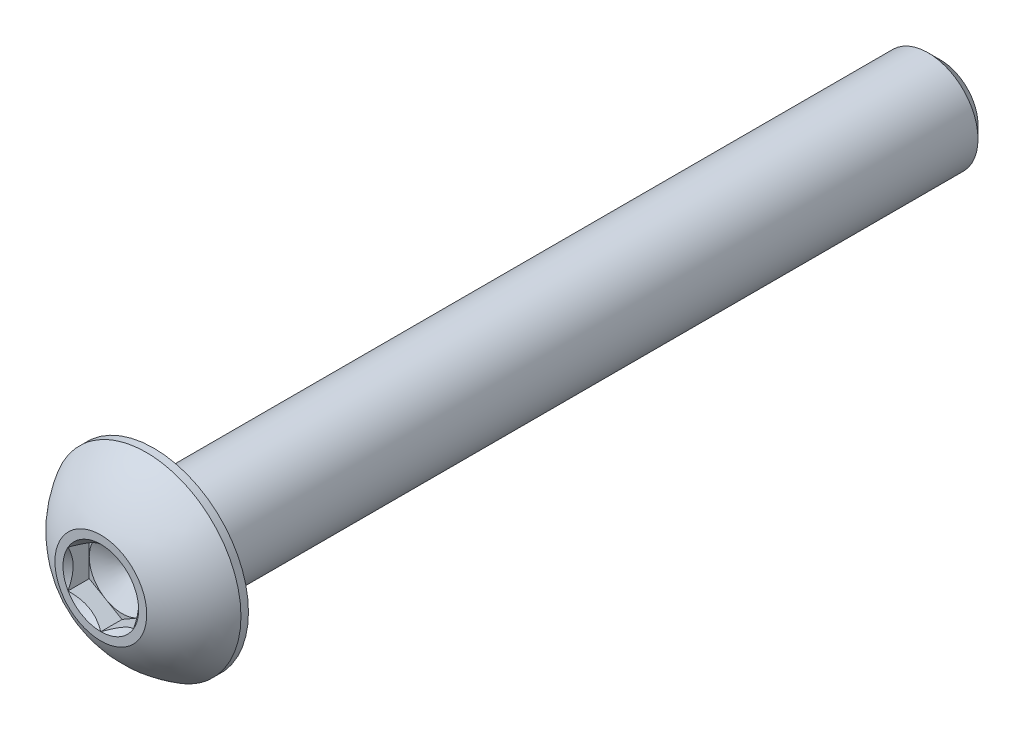
ISO-10303-21;
HEADER;
FILE_DESCRIPTION(('STEP AP214'),'2;1');
FILE_NAME('part.step','',(''),(''),'','','');
FILE_SCHEMA(('AUTOMOTIVE_DESIGN { 1 0 10303 214 1 1 1 1 }'));
ENDSEC;
DATA;
#1=APPLICATION_CONTEXT('core data for automotive mechanical design processes');
#2=APPLICATION_PROTOCOL_DEFINITION('international standard','automotive_design',2000,#1);
#3=PRODUCT_CONTEXT('',#1,'mechanical');
#4=PRODUCT('Part','Part','',(#3));
#5=PRODUCT_RELATED_PRODUCT_CATEGORY('part','',(#4));
#6=PRODUCT_DEFINITION_FORMATION('','',#4);
#7=PRODUCT_DEFINITION_CONTEXT('part definition',#1,'design');
#8=PRODUCT_DEFINITION('design','',#6,#7);
#9=PRODUCT_DEFINITION_SHAPE('','',#8);
#10=(LENGTH_UNIT() NAMED_UNIT(*) SI_UNIT(.MILLI.,.METRE.));
#11=(NAMED_UNIT(*) PLANE_ANGLE_UNIT() SI_UNIT($,.RADIAN.));
#12=(NAMED_UNIT(*) SI_UNIT($,.STERADIAN.) SOLID_ANGLE_UNIT());
#13=UNCERTAINTY_MEASURE_WITH_UNIT(LENGTH_MEASURE(1.E-05),#10,'distance_accuracy_value','');
#14=(GEOMETRIC_REPRESENTATION_CONTEXT(3) GLOBAL_UNCERTAINTY_ASSIGNED_CONTEXT((#13)) GLOBAL_UNIT_ASSIGNED_CONTEXT((#10,
#11,#12)) REPRESENTATION_CONTEXT('',''));
#15=CARTESIAN_POINT('',(0.,0.,0.));
#16=DIRECTION('',(0.,0.,1.));
#17=DIRECTION('',(1.,0.,0.));
#18=AXIS2_PLACEMENT_3D('',#15,#16,#17);
#19=CARTESIAN_POINT('',(0.,0.,19.3065400000592));
#20=DIRECTION('',(0.,0.,1.));
#21=DIRECTION('',(1.,0.,0.));
#22=AXIS2_PLACEMENT_3D('',#19,#20,#21);
#23=CONICAL_SURFACE('',#22,1.58750000002783,1.04719755119209);
#24=CARTESIAN_POINT('',(0.,0.,19.3065400000592));
#25=DIRECTION('',(0.,0.,1.));
#26=DIRECTION('',(1.,0.,0.));
#27=AXIS2_PLACEMENT_3D('',#24,#25,#26);
#28=CIRCLE('',#27,1.58750000002783);
#29=CARTESIAN_POINT('',(-1.58749999999245,0.,19.3065400000302));
#30=VERTEX_POINT('',#29);
#31=CARTESIAN_POINT('',(-0.793750000006907,1.37481532851983,19.3065400000296));
#32=VERTEX_POINT('',#31);
#33=EDGE_CURVE('E102',#30,#32,#28,.F.);
#34=ORIENTED_EDGE('',*,*,#33,.F.);
#35=CARTESIAN_POINT('',(0.,0.,19.3065400000592));
#36=DIRECTION('',(0.,0.,1.));
#37=DIRECTION('',(1.,0.,0.));
#38=AXIS2_PLACEMENT_3D('',#35,#36,#37);
#39=CIRCLE('',#38,1.58750000002783);
#40=CARTESIAN_POINT('',(-0.793750000006925,-1.37481532851986,19.3065400000296));
#41=VERTEX_POINT('',#40);
#42=EDGE_CURVE('E235',#41,#30,#39,.F.);
#43=ORIENTED_EDGE('',*,*,#42,.F.);
#44=CARTESIAN_POINT('',(0.,0.,19.3065400000592));
#45=DIRECTION('',(0.,0.,1.));
#46=DIRECTION('',(1.,0.,0.));
#47=AXIS2_PLACEMENT_3D('',#44,#45,#46);
#48=CIRCLE('',#47,1.58750000002783);
#49=CARTESIAN_POINT('',(0.793750000006907,-1.37481532851983,19.3065400000296));
#50=VERTEX_POINT('',#49);
#51=EDGE_CURVE('E237',#50,#41,#48,.F.);
#52=ORIENTED_EDGE('',*,*,#51,.F.);
#53=CARTESIAN_POINT('',(0.,0.,19.3065400000592));
#54=DIRECTION('',(0.,0.,1.));
#55=DIRECTION('',(1.,0.,0.));
#56=AXIS2_PLACEMENT_3D('',#53,#54,#55);
#57=CIRCLE('',#56,1.58750000002783);
#58=CARTESIAN_POINT('',(1.58749999999245,0.,19.3065400000302));
#59=VERTEX_POINT('',#58);
#60=EDGE_CURVE('E19',#59,#50,#57,.F.);
#61=ORIENTED_EDGE('',*,*,#60,.F.);
#62=CARTESIAN_POINT('',(0.,0.,19.3065400000592));
#63=DIRECTION('',(0.,0.,1.));
#64=DIRECTION('',(1.,0.,0.));
#65=AXIS2_PLACEMENT_3D('',#62,#63,#64);
#66=CIRCLE('',#65,1.58750000002783);
#67=CARTESIAN_POINT('',(0.793750000006925,1.37481532851986,19.3065400000296));
#68=VERTEX_POINT('',#67);
#69=EDGE_CURVE('E106',#68,#59,#66,.F.);
#70=ORIENTED_EDGE('',*,*,#69,.F.);
#71=CARTESIAN_POINT('',(0.,0.,19.3065400000592));
#72=DIRECTION('',(0.,0.,1.));
#73=DIRECTION('',(1.,0.,0.));
#74=AXIS2_PLACEMENT_3D('',#71,#72,#73);
#75=CIRCLE('',#74,1.58750000002783);
#76=EDGE_CURVE('E239',#32,#68,#75,.F.);
#77=ORIENTED_EDGE('',*,*,#76,.F.);
#78=EDGE_LOOP('',(#34,#43,#52,#61,#70,#77));
#79=FACE_BOUND('',#78,.T.);
#80=CARTESIAN_POINT('',(0.,0.,18.389996447695));
#81=VERTEX_POINT('',#80);
#82=VERTEX_LOOP('',#81);
#83=FACE_BOUND('',#82,.T.);
#84=ADVANCED_FACE('F16',(#79,#83),#23,.F.);
#85=CARTESIAN_POINT('',(0.,0.,19.30654));
#86=DIRECTION('',(0.,0.,1.));
#87=DIRECTION('',(1.,0.,0.));
#88=AXIS2_PLACEMENT_3D('',#85,#86,#87);
#89=PLANE('',#88);
#90=DIRECTION('',(0.,1.,0.));
#91=VECTOR('',#90,1.);
#92=CARTESIAN_POINT('',(-1.5875,0.91654355233849,19.30654));
#93=LINE('',#92,#91);
#94=CARTESIAN_POINT('',(-1.58749999999999,0.91654355233847,19.30654));
#95=VERTEX_POINT('',#94);
#96=EDGE_CURVE('E99',#30,#95,#93,.T.);
#97=ORIENTED_EDGE('',*,*,#96,.F.);
#98=ORIENTED_EDGE('',*,*,#33,.T.);
#99=DIRECTION('',(0.866025403784429,0.500000000000017,0.));
#100=VECTOR('',#99,1.);
#101=CARTESIAN_POINT('',(0.,1.83308710467698,19.30654));
#102=LINE('',#101,#100);
#103=EDGE_CURVE('E95',#95,#32,#102,.T.);
#104=ORIENTED_EDGE('',*,*,#103,.F.);
#105=EDGE_LOOP('',(#97,#98,#104));
#106=FACE_BOUND('',#105,.T.);
#107=ADVANCED_FACE('F97',(#106),#89,.T.);
#108=CARTESIAN_POINT('',(0.,0.,19.30654));
#109=DIRECTION('',(0.,0.,1.));
#110=DIRECTION('',(1.,0.,0.));
#111=AXIS2_PLACEMENT_3D('',#108,#109,#110);
#112=PLANE('',#111);
#113=DIRECTION('',(-0.866025403784429,0.500000000000017,0.));
#114=VECTOR('',#113,1.);
#115=CARTESIAN_POINT('',(-1.5875,-0.91654355233849,19.30654));
#116=LINE('',#115,#114);
#117=CARTESIAN_POINT('',(-1.5875,-0.91654355233849,19.30654));
#118=VERTEX_POINT('',#117);
#119=EDGE_CURVE('E188',#41,#118,#116,.T.);
#120=ORIENTED_EDGE('',*,*,#119,.F.);
#121=ORIENTED_EDGE('',*,*,#42,.T.);
#122=DIRECTION('',(0.,1.,0.));
#123=VECTOR('',#122,1.);
#124=CARTESIAN_POINT('',(-1.5875,0.91654355233849,19.30654));
#125=LINE('',#124,#123);
#126=EDGE_CURVE('E119',#118,#30,#125,.T.);
#127=ORIENTED_EDGE('',*,*,#126,.F.);
#128=EDGE_LOOP('',(#120,#121,#127));
#129=FACE_BOUND('',#128,.T.);
#130=ADVANCED_FACE('F234',(#129),#112,.T.);
#131=CARTESIAN_POINT('',(0.,0.,19.30654));
#132=DIRECTION('',(0.,0.,1.));
#133=DIRECTION('',(1.,0.,0.));
#134=AXIS2_PLACEMENT_3D('',#131,#132,#133);
#135=PLANE('',#134);
#136=DIRECTION('',(-0.866025403784429,-0.500000000000017,0.));
#137=VECTOR('',#136,1.);
#138=CARTESIAN_POINT('',(0.,-1.83308710467698,19.30654));
#139=LINE('',#138,#137);
#140=CARTESIAN_POINT('',(0.,-1.833087104677,19.30654));
#141=VERTEX_POINT('',#140);
#142=EDGE_CURVE('E181',#50,#141,#139,.T.);
#143=ORIENTED_EDGE('',*,*,#142,.F.);
#144=ORIENTED_EDGE('',*,*,#51,.T.);
#145=DIRECTION('',(-0.866025403784429,0.500000000000017,0.));
#146=VECTOR('',#145,1.);
#147=CARTESIAN_POINT('',(-1.5875,-0.91654355233849,19.30654));
#148=LINE('',#147,#146);
#149=EDGE_CURVE('E83',#141,#41,#148,.T.);
#150=ORIENTED_EDGE('',*,*,#149,.F.);
#151=EDGE_LOOP('',(#143,#144,#150));
#152=FACE_BOUND('',#151,.T.);
#153=ADVANCED_FACE('F279',(#152),#135,.T.);
#154=CARTESIAN_POINT('',(0.,0.,19.30654));
#155=DIRECTION('',(0.,0.,1.));
#156=DIRECTION('',(1.,0.,0.));
#157=AXIS2_PLACEMENT_3D('',#154,#155,#156);
#158=PLANE('',#157);
#159=DIRECTION('',(0.,1.,0.));
#160=VECTOR('',#159,1.);
#161=CARTESIAN_POINT('',(1.5875,-0.91654355233849,19.30654));
#162=LINE('',#161,#160);
#163=CARTESIAN_POINT('',(1.58749999999999,-0.91654355233847,19.30654));
#164=VERTEX_POINT('',#163);
#165=EDGE_CURVE('E174',#59,#164,#162,.F.);
#166=ORIENTED_EDGE('',*,*,#165,.F.);
#167=ORIENTED_EDGE('',*,*,#60,.T.);
#168=DIRECTION('',(-0.866025403784429,-0.500000000000017,0.));
#169=VECTOR('',#168,1.);
#170=CARTESIAN_POINT('',(0.,-1.83308710467698,19.30654));
#171=LINE('',#170,#169);
#172=EDGE_CURVE('E187',#164,#50,#171,.T.);
#173=ORIENTED_EDGE('',*,*,#172,.F.);
#174=EDGE_LOOP('',(#166,#167,#173));
#175=FACE_BOUND('',#174,.T.);
#176=ADVANCED_FACE('F275',(#175),#158,.T.);
#177=CARTESIAN_POINT('',(0.,0.,19.30654));
#178=DIRECTION('',(0.,0.,1.));
#179=DIRECTION('',(1.,0.,0.));
#180=AXIS2_PLACEMENT_3D('',#177,#178,#179);
#181=PLANE('',#180);
#182=DIRECTION('',(0.866025403784429,0.500000000000017,0.));
#183=VECTOR('',#182,1.);
#184=CARTESIAN_POINT('',(0.,1.83308710467698,19.30654));
#185=LINE('',#184,#183);
#186=CARTESIAN_POINT('',(0.,1.83308710467702,19.30654));
#187=VERTEX_POINT('',#186);
#188=EDGE_CURVE('E105',#32,#187,#185,.T.);
#189=ORIENTED_EDGE('',*,*,#188,.F.);
#190=ORIENTED_EDGE('',*,*,#76,.T.);
#191=DIRECTION('',(0.866025403784429,-0.500000000000017,0.));
#192=VECTOR('',#191,1.);
#193=CARTESIAN_POINT('',(1.5875,0.91654355233849,19.30654));
#194=LINE('',#193,#192);
#195=EDGE_CURVE('E169',#187,#68,#194,.T.);
#196=ORIENTED_EDGE('',*,*,#195,.F.);
#197=EDGE_LOOP('',(#189,#190,#196));
#198=FACE_BOUND('',#197,.T.);
#199=ADVANCED_FACE('F271',(#198),#181,.T.);
#200=CARTESIAN_POINT('',(0.,0.,19.30654));
#201=DIRECTION('',(0.,0.,1.));
#202=DIRECTION('',(1.,0.,0.));
#203=AXIS2_PLACEMENT_3D('',#200,#201,#202);
#204=PLANE('',#203);
#205=DIRECTION('',(0.866025403784429,-0.500000000000017,0.));
#206=VECTOR('',#205,1.);
#207=CARTESIAN_POINT('',(1.5875,0.91654355233849,19.30654));
#208=LINE('',#207,#206);
#209=CARTESIAN_POINT('',(1.5875,0.91654355233849,19.30654));
#210=VERTEX_POINT('',#209);
#211=EDGE_CURVE('E163',#68,#210,#208,.T.);
#212=ORIENTED_EDGE('',*,*,#211,.F.);
#213=ORIENTED_EDGE('',*,*,#69,.T.);
#214=DIRECTION('',(0.,1.,0.));
#215=VECTOR('',#214,1.);
#216=CARTESIAN_POINT('',(1.5875,-0.91654355233849,19.30654));
#217=LINE('',#216,#215);
#218=EDGE_CURVE('E180',#210,#59,#217,.F.);
#219=ORIENTED_EDGE('',*,*,#218,.F.);
#220=EDGE_LOOP('',(#212,#213,#219));
#221=FACE_BOUND('',#220,.T.);
#222=ADVANCED_FACE('F266',(#221),#204,.T.);
#223=CARTESIAN_POINT('',(0.,1.83308710467698,20.3327));
#224=DIRECTION('',(0.500000000000017,-0.866025403784429,0.));
#225=DIRECTION('',(0.866025403784429,0.500000000000017,0.));
#226=AXIS2_PLACEMENT_3D('',#223,#224,#225);
#227=PLANE('',#226);
#228=DIRECTION('',(0.,0.,1.));
#229=VECTOR('',#228,1.);
#230=CARTESIAN_POINT('',(0.,1.83308710467704,20.3327));
#231=LINE('',#230,#229);
#232=CARTESIAN_POINT('',(0.,1.83308710468613,20.3326999999409));
#233=VERTEX_POINT('',#232);
#234=EDGE_CURVE('E166',#233,#187,#231,.F.);
#235=ORIENTED_EDGE('',*,*,#234,.F.);
#236=CARTESIAN_POINT('',(1.94425283346541E-11,1.83308710467467,20.3326999999461));
#237=CARTESIAN_POINT('',(-0.0545631502568171,1.8015850551835,20.3012281822997));
#238=CARTESIAN_POINT('',(-0.110038597579649,1.76955629074181,20.2716050627201));
#239=CARTESIAN_POINT('',(-0.223158727684266,1.70424635317776,20.2173663953937));
#240=CARTESIAN_POINT('',(-0.280814162318059,1.67095897247073,20.1927810161623));
#241=CARTESIAN_POINT('',(-0.3970735180922,1.60383660211802,20.150666096056));
#242=CARTESIAN_POINT('',(-0.455647847440158,1.57001869730163,20.1330307294888));
#243=CARTESIAN_POINT('',(-0.574085662199944,1.50163859306801,20.1058600886252));
#244=CARTESIAN_POINT('',(-0.633945532106868,1.46707848106352,20.096304540075));
#245=CARTESIAN_POINT('',(-0.737116774157612,1.40751253669286,20.0876827418413));
#246=CARTESIAN_POINT('',(-0.780294952331318,1.38258360390116,20.086406821731));
#247=CARTESIAN_POINT('',(-0.866580665890882,1.33276652395034,20.0885591378101));
#248=CARTESIAN_POINT('',(-0.909688171214456,1.30787839414767,20.0919890228481));
#249=CARTESIAN_POINT('',(-0.995485200087328,1.25834345643225,20.1033563141619));
#250=CARTESIAN_POINT('',(-1.03817432946511,1.23369687609451,20.1112976201961));
#251=CARTESIAN_POINT('',(-1.12283605091374,1.18481740842609,20.1312562768218));
#252=CARTESIAN_POINT('',(-1.16480832741676,1.16058470328857,20.1432753762865));
#253=CARTESIAN_POINT('',(-1.2722752796543,1.09853862948523,20.1789438318814));
#254=CARTESIAN_POINT('',(-1.33710455616614,1.06110942923975,20.2052777075293));
#255=CARTESIAN_POINT('',(-1.43242888436957,1.00607390269118,20.2497306145324));
#256=CARTESIAN_POINT('',(-1.46384120999185,0.987937988037281,20.2653483592464));
#257=CARTESIAN_POINT('',(-1.5260884824636,0.951999508519391,20.2980094505172));
#258=CARTESIAN_POINT('',(-1.55692369559623,0.934196789916749,20.3150521187157));
#259=CARTESIAN_POINT('',(-1.58750000001671,0.916543552328763,20.3326999999415));
#260=B_SPLINE_CURVE_WITH_KNOTS('',3,(#236,#237,#238,#239,#240,#241,#242,#243,#244,#245,#246,
#247,#248,#249,#250,#251,#252,#253,#254,#255,#256,#257,#258,#259),.UNSPECIFIED.,.F.,.F.,(4,2,2,
2,2,2,2,2,2,2,2,4),(0.,0.211427927732139,0.424087197148177,0.633370156422353,0.842126401515691,
0.991537201098693,1.14100036552058,1.29059292577272,1.44024972414959,1.67781721417395,
1.7962706941167,1.91466809996097),.UNSPECIFIED.);
#261=CARTESIAN_POINT('',(-1.5875,0.916543552332898,20.3326999999575));
#262=VERTEX_POINT('',#261);
#263=EDGE_CURVE('E113',#233,#262,#260,.T.);
#264=ORIENTED_EDGE('',*,*,#263,.T.);
#265=DIRECTION('',(0.,0.,-1.));
#266=VECTOR('',#265,1.);
#267=CARTESIAN_POINT('',(-1.5875,0.91654355233849,20.3327));
#268=LINE('',#267,#266);
#269=EDGE_CURVE('E110',#95,#262,#268,.F.);
#270=ORIENTED_EDGE('',*,*,#269,.F.);
#271=ORIENTED_EDGE('',*,*,#103,.T.);
#272=ORIENTED_EDGE('',*,*,#188,.T.);
#273=EDGE_LOOP('',(#235,#264,#270,#271,#272));
#274=FACE_BOUND('',#273,.T.);
#275=ADVANCED_FACE('F111',(#274),#227,.T.);
#276=CARTESIAN_POINT('',(-1.5875,0.91654355233849,20.3327));
#277=DIRECTION('',(1.,0.,0.));
#278=DIRECTION('',(0.,0.,-1.));
#279=AXIS2_PLACEMENT_3D('',#276,#277,#278);
#280=PLANE('',#279);
#281=ORIENTED_EDGE('',*,*,#269,.T.);
#282=CARTESIAN_POINT('',(-1.5875,0.916543552336482,20.3326999999877));
#283=CARTESIAN_POINT('',(-1.5875,0.853951042736113,20.3014329469241));
#284=CARTESIAN_POINT('',(-1.5875,0.790318655169812,20.2719915815018));
#285=CARTESIAN_POINT('',(-1.5875,0.660541633646643,20.2180249640259));
#286=CARTESIAN_POINT('',(-1.5875,0.594383506058428,20.1935324485095));
#287=CARTESIAN_POINT('',(-1.5875,0.460155167702125,20.1512391382806));
#288=CARTESIAN_POINT('',(-1.5875,0.392092287361993,20.1334156966591));
#289=CARTESIAN_POINT('',(-1.5875,0.254474472993595,20.1059757377808));
#290=CARTESIAN_POINT('',(-1.5875,0.184924844081273,20.0963338418325));
#291=CARTESIAN_POINT('',(-1.5875,0.0959348173005712,20.0898928821038));
#292=CARTESIAN_POINT('',(-1.5875,0.0767574755171577,20.0888515804515));
#293=CARTESIAN_POINT('',(-1.5875,0.0383876515896924,20.0874614610272));
#294=CARTESIAN_POINT('',(-1.5875,0.0191951833455197,20.0871122670778));
#295=CARTESIAN_POINT('',(-1.5875,-0.048176137388673,20.0871144720552));
#296=CARTESIAN_POINT('',(-1.5875,-0.0963693775085109,20.0893196183869));
#297=CARTESIAN_POINT('',(-1.5875,-0.192379976759693,20.0980092409859));
#298=CARTESIAN_POINT('',(-1.5875,-0.240197050167191,20.1044967019832));
#299=CARTESIAN_POINT('',(-1.5875,-0.38301100218039,20.1299769835574));
#300=CARTESIAN_POINT('',(-1.5875,-0.476967063071661,20.1549833808721));
#301=CARTESIAN_POINT('',(-1.5875,-0.628737189872655,20.2061400287177));
#302=CARTESIAN_POINT('',(-1.5875,-0.687787687826018,20.2288876621353));
#303=CARTESIAN_POINT('',(-1.5875,-0.803652764110899,20.2781891232097));
#304=CARTESIAN_POINT('',(-1.5875,-0.860482853224762,20.3047062344154));
#305=CARTESIAN_POINT('',(-1.5875,-0.916543552336487,20.3326999999877));
#306=B_SPLINE_CURVE_WITH_KNOTS('',3,(#282,#283,#284,#285,#286,#287,#288,#289,#290,#291,#292,
#293,#294,#295,#296,#297,#298,#299,#300,#301,#302,#303,#304,#305),.UNSPECIFIED.,.F.,.F.,(4,2,2,
2,2,2,2,2,2,2,2,4),(0.,0.210047204135309,0.421441388609108,0.63211105943375,0.842124830774508,
0.899732953392242,0.95730975598291,1.10181621377905,1.24642349761814,1.5368326806183,
1.72655304067718,1.91453812061001),.UNSPECIFIED.);
#307=CARTESIAN_POINT('',(-1.5875,-0.916543552337489,20.332699999957));
#308=VERTEX_POINT('',#307);
#309=EDGE_CURVE('E252',#262,#308,#306,.T.);
#310=ORIENTED_EDGE('',*,*,#309,.T.);
#311=DIRECTION('',(0.,0.,1.));
#312=VECTOR('',#311,1.);
#313=CARTESIAN_POINT('',(-1.5875,-0.91654355233849,20.3327));
#314=LINE('',#313,#312);
#315=EDGE_CURVE('E184',#118,#308,#314,.T.);
#316=ORIENTED_EDGE('',*,*,#315,.F.);
#317=ORIENTED_EDGE('',*,*,#126,.T.);
#318=ORIENTED_EDGE('',*,*,#96,.T.);
#319=EDGE_LOOP('',(#281,#310,#316,#317,#318));
#320=FACE_BOUND('',#319,.T.);
#321=ADVANCED_FACE('F117',(#320),#280,.T.);
#322=CARTESIAN_POINT('',(-1.5875,-0.91654355233849,20.3327));
#323=DIRECTION('',(0.500000000000017,0.866025403784429,0.));
#324=DIRECTION('',(-0.866025403784429,0.500000000000017,0.));
#325=AXIS2_PLACEMENT_3D('',#322,#323,#324);
#326=PLANE('',#325);
#327=ORIENTED_EDGE('',*,*,#315,.T.);
#328=CARTESIAN_POINT('',(-1.58750000000584,-0.91654355231484,20.3326999999499));
#329=CARTESIAN_POINT('',(-1.53293684973966,-0.948045601821834,20.3012281823019));
#330=CARTESIAN_POINT('',(-1.47746140242101,-0.980074366270014,20.2716050627215));
#331=CARTESIAN_POINT('',(-1.36434127231956,-1.04538430383878,20.2173663953945));
#332=CARTESIAN_POINT('',(-1.30668583768473,-1.078671684544,20.1927810161633));
#333=CARTESIAN_POINT('',(-1.19042648190998,-1.14579405489533,20.1506660960569));
#334=CARTESIAN_POINT('',(-1.13185215256243,-1.17961195971212,20.1330307294897));
#335=CARTESIAN_POINT('',(-1.01341433780306,-1.24799206394595,20.1058600886258));
#336=CARTESIAN_POINT('',(-0.953554467896143,-1.28255217595026,20.0963045400755));
#337=CARTESIAN_POINT('',(-0.850383225845508,-1.34211812032077,20.0876827418416));
#338=CARTESIAN_POINT('',(-0.807205047671879,-1.36704705311245,20.0864068217311));
#339=CARTESIAN_POINT('',(-0.720919334112446,-1.41686413306322,20.0885591378099));
#340=CARTESIAN_POINT('',(-0.677811828788927,-1.44175226286585,20.0919890228478));
#341=CARTESIAN_POINT('',(-0.59201479991615,-1.49128720058121,20.1033563141614));
#342=CARTESIAN_POINT('',(-0.549325670538407,-1.51593378091893,20.1112976201954));
#343=CARTESIAN_POINT('',(-0.464663949089847,-1.56481324858731,20.131256276821));
#344=CARTESIAN_POINT('',(-0.422691672586863,-1.58904595372481,20.1432753762855));
#345=CARTESIAN_POINT('',(-0.31522472034901,-1.65109202752833,20.1789438318802));
#346=CARTESIAN_POINT('',(-0.250395443836845,-1.688521227774,20.2052777075281));
#347=CARTESIAN_POINT('',(-0.155071115632945,-1.74355675432284,20.2497306145312));
#348=CARTESIAN_POINT('',(-0.123658790010519,-1.76169266897682,20.2653483592453));
#349=CARTESIAN_POINT('',(-0.0614115175384712,-1.79763114849488,20.2980094505162));
#350=CARTESIAN_POINT('',(-0.0305763044057022,-1.8154338670976,20.3150521187147));
#351=CARTESIAN_POINT('',(1.4912483715068E-11,-1.83308710468567,20.3326999999405));
#352=B_SPLINE_CURVE_WITH_KNOTS('',3,(#328,#329,#330,#331,#332,#333,#334,#335,#336,#337,#338,
#339,#340,#341,#342,#343,#344,#345,#346,#347,#348,#349,#350,#351),.UNSPECIFIED.,.F.,.F.,(4,2,2,
2,2,2,2,2,2,2,2,4),(0.,0.211427927732038,0.42408719714786,0.633370156421731,0.842126401514813,
0.991537201097606,1.14100036551926,1.29059292577121,1.44024972414789,1.6778172141733,
1.79627069411655,1.91466809996133),.UNSPECIFIED.);
#353=CARTESIAN_POINT('',(-3.1122501862868E-12,-1.83308710467878,20.3326999999336));
#354=VERTEX_POINT('',#353);
#355=EDGE_CURVE('E511',#308,#354,#352,.T.);
#356=ORIENTED_EDGE('',*,*,#355,.T.);
#357=DIRECTION('',(0.,0.,1.));
#358=VECTOR('',#357,1.);
#359=CARTESIAN_POINT('',(0.,-1.83308710467698,20.3327));
#360=LINE('',#359,#358);
#361=EDGE_CURVE('E177',#141,#354,#360,.T.);
#362=ORIENTED_EDGE('',*,*,#361,.F.);
#363=ORIENTED_EDGE('',*,*,#149,.T.);
#364=ORIENTED_EDGE('',*,*,#119,.T.);
#365=EDGE_LOOP('',(#327,#356,#362,#363,#364));
#366=FACE_BOUND('',#365,.T.);
#367=ADVANCED_FACE('F230',(#366),#326,.T.);
#368=CARTESIAN_POINT('',(0.,-1.83308710467698,20.3327));
#369=DIRECTION('',(-0.500000000000017,0.866025403784429,0.));
#370=DIRECTION('',(-0.866025403784429,-0.500000000000017,0.));
#371=AXIS2_PLACEMENT_3D('',#368,#369,#370);
#372=PLANE('',#371);
#373=ORIENTED_EDGE('',*,*,#361,.T.);
#374=CARTESIAN_POINT('',(-1.94392402666941E-11,-1.83308710467467,20.3326999999461));
#375=CARTESIAN_POINT('',(0.0545631502568184,-1.8015850551835,20.3012281822997));
#376=CARTESIAN_POINT('',(0.110038597579648,-1.76955629074181,20.2716050627201));
#377=CARTESIAN_POINT('',(0.22315872768426,-1.70424635317777,20.2173663953937));
#378=CARTESIAN_POINT('',(0.28081416231805,-1.67095897247074,20.1927810161623));
#379=CARTESIAN_POINT('',(0.39707351809219,-1.60383660211803,20.150666096056));
#380=CARTESIAN_POINT('',(0.455647847440151,-1.57001869730163,20.1330307294888));
#381=CARTESIAN_POINT('',(0.574085662199943,-1.50163859306801,20.1058600886252));
#382=CARTESIAN_POINT('',(0.633945532106869,-1.46707848106352,20.096304540075));
#383=CARTESIAN_POINT('',(0.737116774157617,-1.40751253669286,20.0876827418413));
#384=CARTESIAN_POINT('',(0.780294952331323,-1.38258360390116,20.086406821731));
#385=CARTESIAN_POINT('',(0.866580665890889,-1.33276652395033,20.0885591378101));
#386=CARTESIAN_POINT('',(0.909688171214465,-1.30787839414767,20.0919890228481));
#387=CARTESIAN_POINT('',(0.995485200087336,-1.25834345643224,20.1033563141619));
#388=CARTESIAN_POINT('',(1.03817432946512,-1.23369687609451,20.1112976201961));
#389=CARTESIAN_POINT('',(1.12283605091375,-1.18481740842608,20.1312562768219));
#390=CARTESIAN_POINT('',(1.16480832741676,-1.16058470328857,20.1432753762865));
#391=CARTESIAN_POINT('',(1.27227527965374,-1.09853862948555,20.1789438318812));
#392=CARTESIAN_POINT('',(1.33710455616503,-1.06110942924039,20.2052777075288));
#393=CARTESIAN_POINT('',(1.43242888436768,-1.00607390269227,20.2497306145315));
#394=CARTESIAN_POINT('',(1.4638412099897,-0.987937988038521,20.2653483592453));
#395=CARTESIAN_POINT('',(1.52608848246095,-0.951999508520921,20.2980094505158));
#396=CARTESIAN_POINT('',(1.55692369559333,-0.934196789918421,20.3150521187141));
#397=CARTESIAN_POINT('',(1.58750000001357,-0.916543552330575,20.3326999999396));
#398=B_SPLINE_CURVE_WITH_KNOTS('',3,(#374,#375,#376,#377,#378,#379,#380,#381,#382,#383,#384,
#385,#386,#387,#388,#389,#390,#391,#392,#393,#394,#395,#396,#397),.UNSPECIFIED.,.F.,.F.,(4,2,2,
2,2,2,2,2,2,2,2,4),(0.,0.211427927732129,0.424087197148157,0.633370156422343,0.84212640151569,
0.991537201098695,1.14100036552058,1.29059292577272,1.44024972414959,1.67781721417191,
1.79627069411365,1.91466809995692),.UNSPECIFIED.);
#399=CARTESIAN_POINT('',(1.5875,-0.916543552332898,20.3326999999859));
#400=VERTEX_POINT('',#399);
#401=EDGE_CURVE('E517',#354,#400,#398,.T.);
#402=ORIENTED_EDGE('',*,*,#401,.T.);
#403=DIRECTION('',(0.,0.,1.));
#404=VECTOR('',#403,1.);
#405=CARTESIAN_POINT('',(1.5875,-0.91654355233849,20.3327));
#406=LINE('',#405,#404);
#407=EDGE_CURVE('E170',#164,#400,#406,.T.);
#408=ORIENTED_EDGE('',*,*,#407,.F.);
#409=ORIENTED_EDGE('',*,*,#172,.T.);
#410=ORIENTED_EDGE('',*,*,#142,.T.);
#411=EDGE_LOOP('',(#373,#402,#408,#409,#410));
#412=FACE_BOUND('',#411,.T.);
#413=ADVANCED_FACE('F390',(#412),#372,.T.);
#414=CARTESIAN_POINT('',(1.5875,-0.91654355233849,20.3327));
#415=DIRECTION('',(-1.,0.,0.));
#416=DIRECTION('',(0.,0.,1.));
#417=AXIS2_PLACEMENT_3D('',#414,#415,#416);
#418=PLANE('',#417);
#419=ORIENTED_EDGE('',*,*,#407,.T.);
#420=CARTESIAN_POINT('',(1.58750000001269,-0.916543552311475,20.3327000000251));
#421=CARTESIAN_POINT('',(1.58750000000457,-0.853951042723213,20.3014329469655));
#422=CARTESIAN_POINT('',(1.58750000000123,-0.790318655170106,20.2719915815446));
#423=CARTESIAN_POINT('',(1.58749999999876,-0.660541633674256,20.218024964068));
#424=CARTESIAN_POINT('',(1.58749999999967,-0.594383506100169,20.1935324485496));
#425=CARTESIAN_POINT('',(1.58750000000033,-0.460155167771131,20.1512391383153));
#426=CARTESIAN_POINT('',(1.58750000000008,-0.392092287444118,20.1334156966903));
#427=CARTESIAN_POINT('',(1.58749999999992,-0.254474473101552,20.1059757378032));
#428=CARTESIAN_POINT('',(1.58749999999999,-0.184924844201946,20.0963338418495));
#429=CARTESIAN_POINT('',(1.5875,-0.0959348174114493,20.0898928821112));
#430=CARTESIAN_POINT('',(1.5875,-0.0767574756058952,20.0888515804562));
#431=CARTESIAN_POINT('',(1.5875,-0.0383876516340917,20.0874614610285));
#432=CARTESIAN_POINT('',(1.5875,-0.0191951833677216,20.0871122670781));
#433=CARTESIAN_POINT('',(1.5875,0.0481761373787774,20.0871144720555));
#434=CARTESIAN_POINT('',(1.5875,0.0963693774887013,20.0893196183868));
#435=CARTESIAN_POINT('',(1.5875,0.192379976720111,20.0980092409842));
#436=CARTESIAN_POINT('',(1.5875,0.240197050117751,20.1044967019805));
#437=CARTESIAN_POINT('',(1.5875,0.383011002101596,20.1299769835502));
#438=CARTESIAN_POINT('',(1.5875,0.476967062973502,20.1549833808607));
#439=CARTESIAN_POINT('',(1.5875,0.628737189772149,20.2061400287079));
#440=CARTESIAN_POINT('',(1.5875,0.687787687741506,20.2288876621342));
#441=CARTESIAN_POINT('',(1.5875,0.803652764056442,20.278189123229));
#442=CARTESIAN_POINT('',(1.5875,0.860482853184386,20.3047062344463));
#443=CARTESIAN_POINT('',(1.5875,0.916543552309473,20.332700000031));
#444=B_SPLINE_CURVE_WITH_KNOTS('',3,(#420,#421,#422,#423,#424,#425,#426,#427,#428,#429,#430,
#431,#432,#433,#434,#435,#436,#437,#438,#439,#440,#441,#442,#443),.UNSPECIFIED.,.F.,.F.,(4,2,2,
2,2,2,2,2,2,2,2,4),(0.,0.21004720409777,0.42144138853408,0.63211105932331,0.842124830628684,
0.89973295331313,0.957309755970382,1.10181621373681,1.24642349754615,1.53683268048704,
1.72655304059994,1.91453812058549),.UNSPECIFIED.);
#445=CARTESIAN_POINT('',(1.58749999994593,0.916543552354811,20.3327000000069));
#446=VERTEX_POINT('',#445);
#447=EDGE_CURVE('E34',#400,#446,#444,.T.);
#448=ORIENTED_EDGE('',*,*,#447,.T.);
#449=DIRECTION('',(0.,0.,1.));
#450=VECTOR('',#449,1.);
#451=CARTESIAN_POINT('',(1.5875,0.91654355233849,20.3327));
#452=LINE('',#451,#450);
#453=EDGE_CURVE('E161',#210,#446,#452,.T.);
#454=ORIENTED_EDGE('',*,*,#453,.F.);
#455=ORIENTED_EDGE('',*,*,#218,.T.);
#456=ORIENTED_EDGE('',*,*,#165,.T.);
#457=EDGE_LOOP('',(#419,#448,#454,#455,#456));
#458=FACE_BOUND('',#457,.T.);
#459=ADVANCED_FACE('F383',(#458),#418,.T.);
#460=CARTESIAN_POINT('',(1.5875,0.91654355233849,20.3327));
#461=DIRECTION('',(-0.500000000000017,-0.866025403784429,0.));
#462=DIRECTION('',(0.866025403784429,-0.500000000000017,0.));
#463=AXIS2_PLACEMENT_3D('',#460,#461,#462);
#464=PLANE('',#463);
#465=ORIENTED_EDGE('',*,*,#453,.T.);
#466=CARTESIAN_POINT('',(1.58750000001358,0.916543552330649,20.3326999999397));
#467=CARTESIAN_POINT('',(1.53293684973953,0.948045601829208,20.3012281822966));
#468=CARTESIAN_POINT('',(1.47746140241747,0.980074366274016,20.2716050627183));
#469=CARTESIAN_POINT('',(1.36434127231306,1.04538430384057,20.2173663953929));
#470=CARTESIAN_POINT('',(1.30668583767869,1.07867168454696,20.1927810161612));
#471=CARTESIAN_POINT('',(1.19042648190368,1.14579405489948,20.1506660960546));
#472=CARTESIAN_POINT('',(1.13185215255541,1.17961195971631,20.1330307294876));
#473=CARTESIAN_POINT('',(1.01341433779496,1.24799206395049,20.1058600886244));
#474=CARTESIAN_POINT('',(0.953554467887669,1.28255217595512,20.0963045400743));
#475=CARTESIAN_POINT('',(0.850383225836435,1.34211812032603,20.0876827418411));
#476=CARTESIAN_POINT('',(0.807205047662591,1.36704705311782,20.086406821731));
#477=CARTESIAN_POINT('',(0.720919334102756,1.41686413306881,20.0885591378105));
#478=CARTESIAN_POINT('',(0.677811828779048,1.44175226287155,20.0919890228488));
#479=CARTESIAN_POINT('',(0.592014799905955,1.4912872005871,20.1033563141631));
#480=CARTESIAN_POINT('',(0.549325670528083,1.51593378092489,20.1112976201975));
#481=CARTESIAN_POINT('',(0.464663949079292,1.56481324859341,20.1312562768238));
#482=CARTESIAN_POINT('',(0.422691672576204,1.58904595373097,20.1432753762887));
#483=CARTESIAN_POINT('',(0.315224720340192,1.65109202753342,20.1789438318836));
#484=CARTESIAN_POINT('',(0.250395443829913,1.688521227778,20.2052777075311));
#485=CARTESIAN_POINT('',(0.155071115628716,1.74355675432528,20.2497306145333));
#486=CARTESIAN_POINT('',(0.123658790007159,1.76169266897876,20.265348359247));
#487=CARTESIAN_POINT('',(0.0614115175368152,1.79763114849584,20.2980094505171));
#488=CARTESIAN_POINT('',(0.0305763044048809,1.81543386709808,20.3150521187151));
#489=CARTESIAN_POINT('',(-1.49132163273368E-11,1.83308710468567,20.3326999999405));
#490=B_SPLINE_CURVE_WITH_KNOTS('',3,(#466,#467,#468,#469,#470,#471,#472,#473,#474,#475,#476,
#477,#478,#479,#480,#481,#482,#483,#484,#485,#486,#487,#488,#489),.UNSPECIFIED.,.F.,.F.,(4,2,2,
2,2,2,2,2,2,2,2,4),(0.,0.211427927732891,0.424087197149918,0.633370156425289,0.842126401519713,
0.991537201103186,1.14100036552557,1.29059292577814,1.44024972415544,1.67781721417431,
1.79627069411437,1.91466809995597),.UNSPECIFIED.);
#491=EDGE_CURVE('E533',#446,#233,#490,.T.);
#492=ORIENTED_EDGE('',*,*,#491,.T.);
#493=ORIENTED_EDGE('',*,*,#234,.T.);
#494=ORIENTED_EDGE('',*,*,#195,.T.);
#495=ORIENTED_EDGE('',*,*,#211,.T.);
#496=EDGE_LOOP('',(#465,#492,#493,#494,#495));
#497=FACE_BOUND('',#496,.T.);
#498=ADVANCED_FACE('F376',(#497),#464,.T.);
#499=CARTESIAN_POINT('',(0.,0.,20.3326999998694));
#500=DIRECTION('',(0.,0.,1.));
#501=DIRECTION('',(1.,0.,0.));
#502=AXIS2_PLACEMENT_3D('',#499,#500,#501);
#503=CONICAL_SURFACE('',#502,1.83308710461461,0.785398163512487);
#504=CARTESIAN_POINT('',(0.,0.,20.3326999999263));
#505=DIRECTION('',(0.,0.,1.));
#506=DIRECTION('',(1.,0.,0.));
#507=AXIS2_PLACEMENT_3D('',#504,#505,#506);
#508=CIRCLE('',#507,1.83308710467145);
#509=EDGE_CURVE('E542',#233,#262,#508,.T.);
#510=ORIENTED_EDGE('',*,*,#509,.T.);
#511=ORIENTED_EDGE('',*,*,#263,.F.);
#512=EDGE_LOOP('',(#510,#511));
#513=FACE_BOUND('',#512,.T.);
#514=ADVANCED_FACE('F260',(#513),#503,.F.);
#515=CARTESIAN_POINT('',(0.,0.,20.3326999999831));
#516=DIRECTION('',(0.,0.,1.));
#517=DIRECTION('',(1.,0.,0.));
#518=AXIS2_PLACEMENT_3D('',#515,#516,#517);
#519=CONICAL_SURFACE('',#518,1.83308710467145,0.785398163397448);
#520=ORIENTED_EDGE('',*,*,#309,.F.);
#521=CARTESIAN_POINT('',(0.,0.,20.3326999999831));
#522=DIRECTION('',(0.,0.,1.));
#523=DIRECTION('',(1.,0.,0.));
#524=AXIS2_PLACEMENT_3D('',#521,#522,#523);
#525=CIRCLE('',#524,1.83308710467145);
#526=EDGE_CURVE('E544',#262,#308,#525,.T.);
#527=ORIENTED_EDGE('',*,*,#526,.T.);
#528=EDGE_LOOP('',(#520,#527));
#529=FACE_BOUND('',#528,.T.);
#530=ADVANCED_FACE('F362',(#529),#519,.F.);
#531=CARTESIAN_POINT('',(0.,0.,20.3326999998694));
#532=DIRECTION('',(0.,0.,1.));
#533=DIRECTION('',(1.,0.,0.));
#534=AXIS2_PLACEMENT_3D('',#531,#532,#533);
#535=CONICAL_SURFACE('',#534,1.83308710461461,0.785398163512487);
#536=CARTESIAN_POINT('',(0.,0.,20.3326999999263));
#537=DIRECTION('',(0.,0.,1.));
#538=DIRECTION('',(1.,0.,0.));
#539=AXIS2_PLACEMENT_3D('',#536,#537,#538);
#540=CIRCLE('',#539,1.83308710467145);
#541=EDGE_CURVE('E546',#308,#354,#540,.T.);
#542=ORIENTED_EDGE('',*,*,#541,.T.);
#543=ORIENTED_EDGE('',*,*,#355,.F.);
#544=EDGE_LOOP('',(#542,#543));
#545=FACE_BOUND('',#544,.T.);
#546=ADVANCED_FACE('F354',(#545),#535,.F.);
#547=CARTESIAN_POINT('',(0.,0.,20.3326999998694));
#548=DIRECTION('',(0.,0.,1.));
#549=DIRECTION('',(1.,0.,0.));
#550=AXIS2_PLACEMENT_3D('',#547,#548,#549);
#551=CONICAL_SURFACE('',#550,1.83308710461461,0.785398163512487);
#552=CARTESIAN_POINT('',(0.,0.,20.3326999999263));
#553=DIRECTION('',(0.,0.,1.));
#554=DIRECTION('',(1.,0.,0.));
#555=AXIS2_PLACEMENT_3D('',#552,#553,#554);
#556=CIRCLE('',#555,1.83308710467145);
#557=EDGE_CURVE('E549',#354,#400,#556,.T.);
#558=ORIENTED_EDGE('',*,*,#557,.T.);
#559=ORIENTED_EDGE('',*,*,#401,.F.);
#560=EDGE_LOOP('',(#558,#559));
#561=FACE_BOUND('',#560,.T.);
#562=ADVANCED_FACE('F346',(#561),#551,.F.);
#563=CARTESIAN_POINT('',(0.,0.,20.3326999999263));
#564=DIRECTION('',(0.,0.,1.));
#565=DIRECTION('',(1.,0.,0.));
#566=AXIS2_PLACEMENT_3D('',#563,#564,#565);
#567=CONICAL_SURFACE('',#566,1.83308710455776,0.785398163282409);
#568=CARTESIAN_POINT('',(0.,0.,20.3326999999831));
#569=DIRECTION('',(0.,0.,1.));
#570=DIRECTION('',(1.,0.,0.));
#571=AXIS2_PLACEMENT_3D('',#568,#569,#570);
#572=CIRCLE('',#571,1.83308710461461);
#573=EDGE_CURVE('E551',#400,#446,#572,.T.);
#574=ORIENTED_EDGE('',*,*,#573,.T.);
#575=ORIENTED_EDGE('',*,*,#447,.F.);
#576=EDGE_LOOP('',(#574,#575));
#577=FACE_BOUND('',#576,.T.);
#578=ADVANCED_FACE('F339',(#577),#567,.F.);
#579=CARTESIAN_POINT('',(0.,0.,20.3326999998694));
#580=DIRECTION('',(0.,0.,1.));
#581=DIRECTION('',(1.,0.,0.));
#582=AXIS2_PLACEMENT_3D('',#579,#580,#581);
#583=CONICAL_SURFACE('',#582,1.83308710461461,0.785398163512487);
#584=CARTESIAN_POINT('',(0.,0.,20.3326999999263));
#585=DIRECTION('',(0.,0.,1.));
#586=DIRECTION('',(1.,0.,0.));
#587=AXIS2_PLACEMENT_3D('',#584,#585,#586);
#588=CIRCLE('',#587,1.83308710467145);
#589=EDGE_CURVE('E146',#446,#233,#588,.T.);
#590=ORIENTED_EDGE('',*,*,#589,.T.);
#591=ORIENTED_EDGE('',*,*,#491,.F.);
#592=EDGE_LOOP('',(#590,#591));
#593=FACE_BOUND('',#592,.T.);
#594=ADVANCED_FACE('F332',(#593),#583,.F.);
#595=CARTESIAN_POINT('',(0.,1.5875,20.3327));
#596=DIRECTION('',(0.,0.,-1.));
#597=DIRECTION('',(-1.,0.,0.));
#598=AXIS2_PLACEMENT_3D('',#595,#596,#597);
#599=PLANE('',#598);
#600=ORIENTED_EDGE('',*,*,#573,.F.);
#601=ORIENTED_EDGE('',*,*,#557,.F.);
#602=ORIENTED_EDGE('',*,*,#541,.F.);
#603=ORIENTED_EDGE('',*,*,#526,.F.);
#604=ORIENTED_EDGE('',*,*,#509,.F.);
#605=ORIENTED_EDGE('',*,*,#589,.F.);
#606=EDGE_LOOP('',(#600,#601,#602,#603,#604,#605));
#607=FACE_BOUND('',#606,.T.);
#608=CARTESIAN_POINT('',(-2.22249999999856,0.,20.3327));
#609=CARTESIAN_POINT('',(-2.22249468224888,0.124849481960498,20.3327));
#610=CARTESIAN_POINT('',(-2.21194534333567,0.249781680267586,20.3327));
#611=CARTESIAN_POINT('',(-2.17001095116572,0.496196929836012,20.3327));
#612=CARTESIAN_POINT('',(-2.13860287056191,0.617676014243876,20.3327));
#613=CARTESIAN_POINT('',(-2.0558445622265,0.853594097529323,20.3327));
#614=CARTESIAN_POINT('',(-2.00450274735446,0.968036042799012,20.3327));
#615=CARTESIAN_POINT('',(-1.88334812535421,1.18664272479291,20.3327));
#616=CARTESIAN_POINT('',(-1.81354015237296,1.29081014144187,20.3327));
#617=CARTESIAN_POINT('',(-1.65742964075778,1.48594942595832,20.3327));
#618=CARTESIAN_POINT('',(-1.57112709942546,1.57692129166713,20.3327));
#619=CARTESIAN_POINT('',(-1.38444815146017,1.74310881908249,20.3327));
#620=CARTESIAN_POINT('',(-1.28406807368616,1.81832035800818,20.3327));
#621=CARTESIAN_POINT('',(-1.07207137577972,1.95084823770154,20.3327));
#622=CARTESIAN_POINT('',(-0.960450037970663,2.00815702339566,20.3327));
#623=CARTESIAN_POINT('',(-0.729250578600589,2.10316112045393,20.3327));
#624=CARTESIAN_POINT('',(-0.609681374185683,2.14087800766924,20.3327));
#625=CARTESIAN_POINT('',(-0.407875014298316,2.18629468295506,20.3327));
#626=CARTESIAN_POINT('',(-0.326908015536061,2.19985370841654,20.3327));
#627=CARTESIAN_POINT('',(-0.163972572228991,2.217958108369,20.3327));
#628=CARTESIAN_POINT('',(-0.0820041288545471,2.22250349339305,20.3326999999999));
#629=CARTESIAN_POINT('',(0.124849583592798,2.22249468137799,20.3327000000001));
#630=CARTESIAN_POINT('',(0.249781884095453,2.21194532173533,20.3327000000005));
#631=CARTESIAN_POINT('',(0.496197128213135,2.17001090428774,20.3326999999995));
#632=CARTESIAN_POINT('',(0.617676110809344,2.13860285304618,20.332699999998));
#633=CARTESIAN_POINT('',(0.853592036593374,2.05584526884014,20.3326999999983));
#634=CARTESIAN_POINT('',(0.968032042506756,2.00450448092668,20.3326999999999));
#635=CARTESIAN_POINT('',(1.18663905882549,1.88335064044688,20.3327000000001));
#636=CARTESIAN_POINT('',(1.29080839111282,1.81354177614629,20.3326999999986));
#637=CARTESIAN_POINT('',(1.48596046714852,1.65742058432211,20.3326999999983));
#638=CARTESIAN_POINT('',(1.57694195214949,1.57110668325469,20.3326999999995));
#639=CARTESIAN_POINT('',(1.74312574447914,1.38442634647323,20.3327000000005));
#640=CARTESIAN_POINT('',(1.81832748571596,1.28405940682743,20.3327000000001));
#641=CARTESIAN_POINT('',(1.95081210024061,1.07212644780129,20.3326999999999));
#642=CARTESIAN_POINT('',(2.00809526822023,0.960560612639673,20.3327));
#643=CARTESIAN_POINT('',(2.10311786571456,0.729395471801191,20.3327));
#644=CARTESIAN_POINT('',(2.14085735333554,0.609796190010157,20.3327));
#645=CARTESIAN_POINT('',(2.19572247161697,0.365960143196633,20.3327));
#646=CARTESIAN_POINT('',(2.21284806858038,0.241723370593687,20.3327));
#647=CARTESIAN_POINT('',(2.22599589537013,-0.00786601305136581,20.3327));
#648=CARTESIAN_POINT('',(2.22201813144672,-0.133218623762982,20.3327));
#649=CARTESIAN_POINT('',(2.19308435171073,-0.381460949459706,20.3327));
#650=CARTESIAN_POINT('',(2.16812844081151,-0.50435067675874,20.3327));
#651=CARTESIAN_POINT('',(2.09790136985737,-0.744254406518564,20.3327));
#652=CARTESIAN_POINT('',(2.05263000059212,-0.861268348456216,20.3327));
#653=CARTESIAN_POINT('',(1.97054825567724,-1.02974239243858,20.3327));
#654=CARTESIAN_POINT('',(1.9408060282605,-1.08475275168671,20.3327));
#655=CARTESIAN_POINT('',(1.8767951349808,-1.19207538437547,20.3327));
#656=CARTESIAN_POINT('',(1.84252751886055,-1.24438827963864,20.3327));
#657=CARTESIAN_POINT('',(1.76972192877625,-1.34591651488365,20.3327));
#658=CARTESIAN_POINT('',(1.73118589476191,-1.39513324622072,20.3327));
#659=CARTESIAN_POINT('',(1.65008030270426,-1.4901854387619,20.3327));
#660=CARTESIAN_POINT('',(1.60750688787279,-1.53601759092473,20.3327));
#661=CARTESIAN_POINT('',(1.47426253608566,-1.66782178283192,20.3327));
#662=CARTESIAN_POINT('',(1.3779708110162,-1.74823610349469,20.3327));
#663=CARTESIAN_POINT('',(1.17324187710599,-1.89172801995187,20.3327));
#664=CARTESIAN_POINT('',(1.06480513104278,-1.9548062760088,20.3327));
#665=CARTESIAN_POINT('',(0.895397178579559,-2.03511690695769,20.3327));
#666=CARTESIAN_POINT('',(0.837729709269854,-2.05952315367188,20.3327));
#667=CARTESIAN_POINT('',(0.720574919285126,-2.10337387792353,20.3327));
#668=CARTESIAN_POINT('',(0.6610891143809,-2.12282236839951,20.3327));
#669=CARTESIAN_POINT('',(0.540790479065859,-2.15660638389716,20.3327));
#670=CARTESIAN_POINT('',(0.479979906293117,-2.17094998030877,20.3327));
#671=CARTESIAN_POINT('',(0.357379432723803,-2.1944657316671,20.3327));
#672=CARTESIAN_POINT('',(0.295589828742678,-2.20363942427137,20.3327));
#673=CARTESIAN_POINT('',(0.194751619850328,-2.21429424221135,20.3327));
#674=CARTESIAN_POINT('',(0.155865534713329,-2.21737007210024,20.3327));
#675=CARTESIAN_POINT('',(0.0779919414964895,-2.22147388559843,20.3327));
#676=CARTESIAN_POINT('',(0.0390044333587543,-2.22250186803849,20.3327));
#677=CARTESIAN_POINT('',(-0.124732304478435,-2.22249402619239,20.3327000000001));
#678=CARTESIAN_POINT('',(-0.249637695894828,-2.21195621555353,20.3327000000005));
#679=CARTESIAN_POINT('',(-0.496084702466514,-2.17004370352541,20.3326999999995));
#680=CARTESIAN_POINT('',(-0.617618532187329,-2.13862437979542,20.332699999998));
#681=CARTESIAN_POINT('',(-0.85360499661213,-2.05583939505529,20.3326999999983));
#682=CARTESIAN_POINT('',(-0.968063328720086,-2.00449003138882,20.3326999999999));
#683=CARTESIAN_POINT('',(-1.18666945103997,-1.88333090680179,20.3327000000001));
#684=CARTESIAN_POINT('',(-1.29082244569941,-1.81353053016791,20.3326999999986));
#685=CARTESIAN_POINT('',(-1.48594668385716,-1.65743161326518,20.3326999999983));
#686=CARTESIAN_POINT('',(-1.57691663217528,-1.57113145388958,20.3326999999995));
#687=CARTESIAN_POINT('',(-1.74310510330589,-1.38445320506554,20.3327000000005));
#688=CARTESIAN_POINT('',(-1.81831871073933,-1.28407073873091,20.3327000000001));
#689=CARTESIAN_POINT('',(-1.95084848827906,-1.07207094492422,20.3326999999999));
#690=CARTESIAN_POINT('',(-2.00815748116564,-0.960449135711144,20.3327));
#691=CARTESIAN_POINT('',(-2.10316143008117,-0.729249613799311,20.3327));
#692=CARTESIAN_POINT('',(-2.14087811924559,-0.609680883224077,20.3327));
#693=CARTESIAN_POINT('',(-2.18629466707524,-0.407875081692614,20.3327));
#694=CARTESIAN_POINT('',(-2.19985368561396,-0.326908151565276,20.3327));
#695=CARTESIAN_POINT('',(-2.21795810077641,-0.163972709749063,20.3327));
#696=CARTESIAN_POINT('',(-2.2225034928268,-0.0820041975520253,20.3327));
#697=CARTESIAN_POINT('',(-2.22249999999856,0.,20.3327));
#698=B_SPLINE_CURVE_WITH_KNOTS('',3,(#608,#609,#610,#611,#612,#613,#614,#615,#616,#617,#618,
#619,#620,#621,#622,#623,#624,#625,#626,#627,#628,#629,#630,#631,#632,#633,#634,#635,#636,#637,
#638,#639,#640,#641,#642,#643,#644,#645,#646,#647,#648,#649,#650,#651,#652,#653,#654,#655,#656,
#657,#658,#659,#660,#661,#662,#663,#664,#665,#666,#667,#668,#669,#670,#671,#672,#673,#674,#675,
#676,#677,#678,#679,#680,#681,#682,#683,#684,#685,#686,#687,#688,#689,#690,#691,#692,#693,#694,
#695,#696,#697),.UNSPECIFIED.,.T.,.F.,(4,2,2,2,2,2,2,2,2,2,2,2,2,2,2,2,2,2,2,2,2,2,2,2,2,2,2,2,
2,2,2,2,2,2,2,2,2,2,2,2,2,2,2,2,4),(0.,0.37425009532994,0.748914038461893,1.12342002951108,
1.49782807769529,1.87223618713013,2.24674211692881,2.62140587773044,2.99565615539214,
3.24147286536428,3.48728928808212,3.86153968797394,4.23620332654574,4.61070277507593,
4.98511736578996,5.35956766995153,5.73403140506932,6.10848898137131,6.48294544434848,
6.85740251944002,7.23185948362766,7.60631457513773,7.98077352290676,8.16819840931074,
8.35557989536673,8.54287656532444,8.73035399185781,9.10481814341871,9.47926803113601,
9.6669402813431,9.8544601388596,10.0416821760516,10.2288484993405,10.3458176875426,
10.462786942529,10.8368430041409,11.2117009787389,11.586253065261,11.9606150178449,
12.3350137250556,12.7095290570603,13.0841943247228,13.4584430955116,13.7042595994958,
13.9500762282025),.UNSPECIFIED.);
#699=CARTESIAN_POINT('',(-2.22249999999856,0.,20.3327));
#700=VERTEX_POINT('',#699);
#701=EDGE_CURVE('E138',#700,#700,#698,.T.);
#702=ORIENTED_EDGE('',*,*,#701,.F.);
#703=EDGE_LOOP('',(#702));
#704=FACE_BOUND('',#703,.T.);
#705=ADVANCED_FACE('F148',(#607,#704),#599,.F.);
#706=CARTESIAN_POINT('',(0.,0.,15.5811096257931));
#707=DIRECTION('',(0.,1.,0.));
#708=DIRECTION('',(0.,0.,-1.));
#709=AXIS2_PLACEMENT_3D('',#706,#707,#708);
#710=SPHERICAL_SURFACE('',#709,5.24567606074272);
#711=ORIENTED_EDGE('',*,*,#701,.T.);
#712=EDGE_LOOP('',(#711));
#713=FACE_BOUND('',#712,.T.);
#714=CARTESIAN_POINT('',(0.,0.,18.1301571428568));
#715=DIRECTION('',(0.,0.,1.));
#716=DIRECTION('',(1.,0.,0.));
#717=AXIS2_PLACEMENT_3D('',#714,#715,#716);
#718=CIRCLE('',#717,4.5847);
#719=CARTESIAN_POINT('',(4.5847,0.,18.1301571428568));
#720=VERTEX_POINT('',#719);
#721=EDGE_CURVE('E135',#720,#720,#718,.F.);
#722=ORIENTED_EDGE('',*,*,#721,.F.);
#723=EDGE_LOOP('',(#722));
#724=FACE_BOUND('',#723,.T.);
#725=ADVANCED_FACE('F151',(#713,#724),#710,.T.);
#726=CARTESIAN_POINT('',(0.,0.,20.3327));
#727=DIRECTION('',(0.,0.,1.));
#728=DIRECTION('',(1.,0.,0.));
#729=AXIS2_PLACEMENT_3D('',#726,#727,#728);
#730=CYLINDRICAL_SURFACE('',#729,4.5847);
#731=ORIENTED_EDGE('',*,*,#721,.T.);
#732=EDGE_LOOP('',(#731));
#733=FACE_BOUND('',#732,.T.);
#734=CARTESIAN_POINT('',(0.,0.,17.7673));
#735=DIRECTION('',(0.,0.,1.));
#736=DIRECTION('',(1.,0.,0.));
#737=AXIS2_PLACEMENT_3D('',#734,#735,#736);
#738=CIRCLE('',#737,4.5847);
#739=CARTESIAN_POINT('',(4.5847,0.,17.7673));
#740=VERTEX_POINT('',#739);
#741=EDGE_CURVE('E132',#740,#740,#738,.T.);
#742=ORIENTED_EDGE('',*,*,#741,.T.);
#743=EDGE_LOOP('',(#742));
#744=FACE_BOUND('',#743,.T.);
#745=ADVANCED_FACE('F156',(#733,#744),#730,.T.);
#746=CARTESIAN_POINT('',(0.,1.8176875,-20.3327));
#747=DIRECTION('',(0.,0.,1.));
#748=DIRECTION('',(1.,0.,0.));
#749=AXIS2_PLACEMENT_3D('',#746,#747,#748);
#750=PLANE('',#749);
#751=CARTESIAN_POINT('',(0.,0.,-20.3326999999831));
#752=DIRECTION('',(0.,0.,1.));
#753=DIRECTION('',(1.,0.,0.));
#754=AXIS2_PLACEMENT_3D('',#751,#752,#753);
#755=CIRCLE('',#754,1.8176875000222);
#756=CARTESIAN_POINT('',(1.8176875000222,0.,-20.3326999999831));
#757=VERTEX_POINT('',#756);
#758=EDGE_CURVE('E129',#757,#757,#755,.T.);
#759=ORIENTED_EDGE('',*,*,#758,.F.);
#760=EDGE_LOOP('',(#759));
#761=FACE_BOUND('',#760,.T.);
#762=ADVANCED_FACE('F303',(#761),#750,.F.);
#763=CARTESIAN_POINT('',(0.,4.5847,17.7673));
#764=DIRECTION('',(0.,0.,1.));
#765=DIRECTION('',(1.,0.,0.));
#766=AXIS2_PLACEMENT_3D('',#763,#764,#765);
#767=PLANE('',#766);
#768=CARTESIAN_POINT('',(0.,0.,17.7673));
#769=DIRECTION('',(0.,0.,1.));
#770=DIRECTION('',(1.,0.,0.));
#771=AXIS2_PLACEMENT_3D('',#768,#769,#770);
#772=CIRCLE('',#771,2.413);
#773=CARTESIAN_POINT('',(2.413,0.,17.7673));
#774=VERTEX_POINT('',#773);
#775=EDGE_CURVE('E25',#774,#774,#772,.F.);
#776=ORIENTED_EDGE('',*,*,#775,.F.);
#777=EDGE_LOOP('',(#776));
#778=FACE_BOUND('',#777,.T.);
#779=ORIENTED_EDGE('',*,*,#741,.F.);
#780=EDGE_LOOP('',(#779));
#781=FACE_BOUND('',#780,.T.);
#782=ADVANCED_FACE('F297',(#778,#781),#767,.F.);
#783=CARTESIAN_POINT('',(0.,0.,-19.737387500129));
#784=DIRECTION('',(0.,0.,1.));
#785=DIRECTION('',(1.,0.,0.));
#786=AXIS2_PLACEMENT_3D('',#783,#784,#785);
#787=CONICAL_SURFACE('',#786,2.41299999993316,0.785398163445191);
#788=CARTESIAN_POINT('',(0.,0.,-19.7373875));
#789=DIRECTION('',(0.,0.,1.));
#790=DIRECTION('',(1.,0.,0.));
#791=AXIS2_PLACEMENT_3D('',#788,#789,#790);
#792=CIRCLE('',#791,2.413);
#793=CARTESIAN_POINT('',(2.413,0.,-19.7373875));
#794=VERTEX_POINT('',#793);
#795=EDGE_CURVE('E11',#794,#794,#792,.T.);
#796=ORIENTED_EDGE('',*,*,#795,.F.);
#797=EDGE_LOOP('',(#796));
#798=FACE_BOUND('',#797,.T.);
#799=ORIENTED_EDGE('',*,*,#758,.T.);
#800=EDGE_LOOP('',(#799));
#801=FACE_BOUND('',#800,.T.);
#802=ADVANCED_FACE('F291',(#798,#801),#787,.T.);
#803=CARTESIAN_POINT('',(0.,0.,20.3327));
#804=DIRECTION('',(0.,0.,1.));
#805=DIRECTION('',(1.,0.,0.));
#806=AXIS2_PLACEMENT_3D('',#803,#804,#805);
#807=CYLINDRICAL_SURFACE('',#806,2.413);
#808=ORIENTED_EDGE('',*,*,#775,.T.);
#809=EDGE_LOOP('',(#808));
#810=FACE_BOUND('',#809,.T.);
#811=ORIENTED_EDGE('',*,*,#795,.T.);
#812=EDGE_LOOP('',(#811));
#813=FACE_BOUND('',#812,.T.);
#814=ADVANCED_FACE('F289',(#810,#813),#807,.T.);
#815=CLOSED_SHELL('',(#84,#107,#130,#153,#176,#199,#222,#275,#321,#367,#413,#459,#498,#514,#530,
#546,#562,#578,#594,#705,#725,#745,#762,#782,#802,#814));
#816=MANIFOLD_SOLID_BREP('B1',#815);
#817=ADVANCED_BREP_SHAPE_REPRESENTATION('',(#18,#816),#14);
#818=SHAPE_DEFINITION_REPRESENTATION(#9,#817);
ENDSEC;
END-ISO-10303-21;
